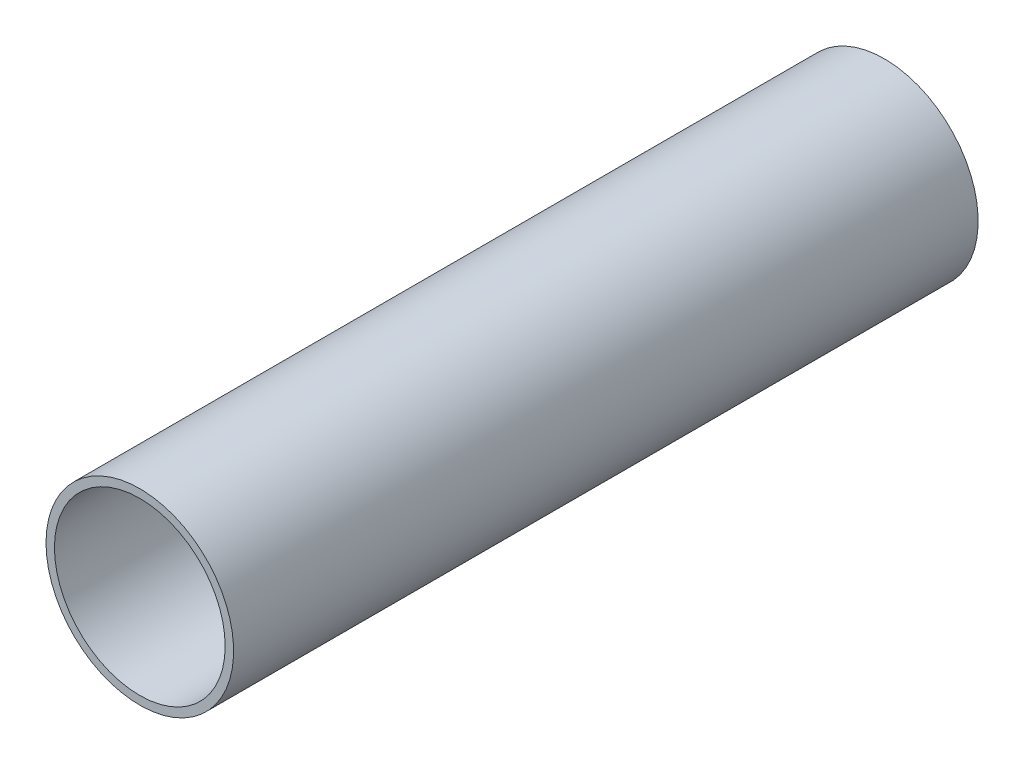
ISO-10303-21;
HEADER;
FILE_DESCRIPTION(('STEP AP214'),'2;1');
FILE_NAME('part.step','',(''),(''),'','','');
FILE_SCHEMA(('AUTOMOTIVE_DESIGN { 1 0 10303 214 1 1 1 1 }'));
ENDSEC;
DATA;
#1=APPLICATION_CONTEXT('core data for automotive mechanical design processes');
#2=APPLICATION_PROTOCOL_DEFINITION('international standard','automotive_design',2000,#1);
#3=PRODUCT_CONTEXT('',#1,'mechanical');
#4=PRODUCT('Part','Part','',(#3));
#5=PRODUCT_RELATED_PRODUCT_CATEGORY('part','',(#4));
#6=PRODUCT_DEFINITION_FORMATION('','',#4);
#7=PRODUCT_DEFINITION_CONTEXT('part definition',#1,'design');
#8=PRODUCT_DEFINITION('design','',#6,#7);
#9=PRODUCT_DEFINITION_SHAPE('','',#8);
#10=(LENGTH_UNIT() NAMED_UNIT(*) SI_UNIT(.MILLI.,.METRE.));
#11=(NAMED_UNIT(*) PLANE_ANGLE_UNIT() SI_UNIT($,.RADIAN.));
#12=(NAMED_UNIT(*) SI_UNIT($,.STERADIAN.) SOLID_ANGLE_UNIT());
#13=UNCERTAINTY_MEASURE_WITH_UNIT(LENGTH_MEASURE(1.E-05),#10,'distance_accuracy_value','');
#14=(GEOMETRIC_REPRESENTATION_CONTEXT(3) GLOBAL_UNCERTAINTY_ASSIGNED_CONTEXT((#13)) GLOBAL_UNIT_ASSIGNED_CONTEXT((#10,
#11,#12)) REPRESENTATION_CONTEXT('',''));
#15=CARTESIAN_POINT('',(0.,0.,0.));
#16=DIRECTION('',(0.,0.,1.));
#17=DIRECTION('',(1.,0.,0.));
#18=AXIS2_PLACEMENT_3D('',#15,#16,#17);
#19=CARTESIAN_POINT('',(0.,0.,152.4));
#20=DIRECTION('',(0.,0.,1.));
#21=DIRECTION('',(1.,0.,0.));
#22=AXIS2_PLACEMENT_3D('',#19,#20,#21);
#23=PLANE('',#22);
#24=CARTESIAN_POINT('',(0.,0.,152.4));
#25=DIRECTION('',(0.,0.,1.));
#26=DIRECTION('',(1.,0.,0.));
#27=AXIS2_PLACEMENT_3D('',#24,#25,#26);
#28=CIRCLE('',#27,19.2);
#29=CARTESIAN_POINT('',(-19.2,0.,152.4));
#30=VERTEX_POINT('',#29);
#31=EDGE_CURVE('E10',#30,#30,#28,.T.);
#32=ORIENTED_EDGE('',*,*,#31,.T.);
#33=EDGE_LOOP('',(#32));
#34=FACE_BOUND('',#33,.T.);
#35=CARTESIAN_POINT('',(0.,0.,152.4));
#36=DIRECTION('',(0.,0.,1.));
#37=DIRECTION('',(1.,0.,0.));
#38=AXIS2_PLACEMENT_3D('',#35,#36,#37);
#39=CIRCLE('',#38,17.475);
#40=CARTESIAN_POINT('',(-17.475,0.,152.4));
#41=VERTEX_POINT('',#40);
#42=EDGE_CURVE('E52',#41,#41,#39,.T.);
#43=ORIENTED_EDGE('',*,*,#42,.F.);
#44=EDGE_LOOP('',(#43));
#45=FACE_BOUND('',#44,.T.);
#46=ADVANCED_FACE('F41',(#34,#45),#23,.T.);
#47=CARTESIAN_POINT('',(0.,0.,0.));
#48=DIRECTION('',(0.,0.,1.));
#49=DIRECTION('',(1.,0.,0.));
#50=AXIS2_PLACEMENT_3D('',#47,#48,#49);
#51=PLANE('',#50);
#52=CARTESIAN_POINT('',(0.,0.,0.));
#53=DIRECTION('',(0.,0.,1.));
#54=DIRECTION('',(1.,0.,0.));
#55=AXIS2_PLACEMENT_3D('',#52,#53,#54);
#56=CIRCLE('',#55,19.2);
#57=CARTESIAN_POINT('',(-19.2,0.,0.));
#58=VERTEX_POINT('',#57);
#59=EDGE_CURVE('E45',#58,#58,#56,.T.);
#60=ORIENTED_EDGE('',*,*,#59,.F.);
#61=EDGE_LOOP('',(#60));
#62=FACE_BOUND('',#61,.T.);
#63=CARTESIAN_POINT('',(0.,0.,0.));
#64=DIRECTION('',(0.,0.,1.));
#65=DIRECTION('',(1.,0.,0.));
#66=AXIS2_PLACEMENT_3D('',#63,#64,#65);
#67=CIRCLE('',#66,17.475);
#68=CARTESIAN_POINT('',(-17.475,0.,0.));
#69=VERTEX_POINT('',#68);
#70=EDGE_CURVE('E54',#69,#69,#67,.T.);
#71=ORIENTED_EDGE('',*,*,#70,.T.);
#72=EDGE_LOOP('',(#71));
#73=FACE_BOUND('',#72,.T.);
#74=ADVANCED_FACE('F64',(#62,#73),#51,.F.);
#75=CARTESIAN_POINT('',(0.,0.,152.4));
#76=DIRECTION('',(0.,0.,-1.));
#77=DIRECTION('',(-1.,0.,0.));
#78=AXIS2_PLACEMENT_3D('',#75,#76,#77);
#79=CYLINDRICAL_SURFACE('',#78,19.2);
#80=CARTESIAN_POINT('',(-19.2,0.,152.4));
#81=CARTESIAN_POINT('',(-19.2,0.,150.8125));
#82=CARTESIAN_POINT('',(-19.2,0.,149.225));
#83=CARTESIAN_POINT('',(-19.2,0.,146.05));
#84=CARTESIAN_POINT('',(-19.2,0.,144.4625));
#85=CARTESIAN_POINT('',(-19.2,0.,141.2875));
#86=CARTESIAN_POINT('',(-19.2,0.,139.7));
#87=CARTESIAN_POINT('',(-19.2,0.,136.525));
#88=CARTESIAN_POINT('',(-19.2,0.,134.9375));
#89=CARTESIAN_POINT('',(-19.2,0.,131.7625));
#90=CARTESIAN_POINT('',(-19.2,0.,130.175));
#91=CARTESIAN_POINT('',(-19.2,0.,127.));
#92=CARTESIAN_POINT('',(-19.2,0.,125.4125));
#93=CARTESIAN_POINT('',(-19.2,0.,122.2375));
#94=CARTESIAN_POINT('',(-19.2,0.,120.65));
#95=CARTESIAN_POINT('',(-19.2,0.,117.475));
#96=CARTESIAN_POINT('',(-19.2,0.,115.8875));
#97=CARTESIAN_POINT('',(-19.2,0.,112.7125));
#98=CARTESIAN_POINT('',(-19.2,0.,111.125));
#99=CARTESIAN_POINT('',(-19.2,0.,107.95));
#100=CARTESIAN_POINT('',(-19.2,0.,106.3625));
#101=CARTESIAN_POINT('',(-19.2,0.,103.1875));
#102=CARTESIAN_POINT('',(-19.2,0.,101.6));
#103=CARTESIAN_POINT('',(-19.2,0.,98.425));
#104=CARTESIAN_POINT('',(-19.2,0.,96.8375));
#105=CARTESIAN_POINT('',(-19.2,0.,93.6625));
#106=CARTESIAN_POINT('',(-19.2,0.,92.075));
#107=CARTESIAN_POINT('',(-19.2,0.,88.9));
#108=CARTESIAN_POINT('',(-19.2,0.,87.3125));
#109=CARTESIAN_POINT('',(-19.2,0.,84.1375));
#110=CARTESIAN_POINT('',(-19.2,0.,82.55));
#111=CARTESIAN_POINT('',(-19.2,0.,79.375));
#112=CARTESIAN_POINT('',(-19.2,0.,77.7875));
#113=CARTESIAN_POINT('',(-19.2,0.,74.6125));
#114=CARTESIAN_POINT('',(-19.2,0.,73.025));
#115=CARTESIAN_POINT('',(-19.2,0.,69.85));
#116=CARTESIAN_POINT('',(-19.2,0.,68.2625));
#117=CARTESIAN_POINT('',(-19.2,0.,65.0875));
#118=CARTESIAN_POINT('',(-19.2,0.,63.5));
#119=CARTESIAN_POINT('',(-19.2,0.,60.325));
#120=CARTESIAN_POINT('',(-19.2,0.,58.7375));
#121=CARTESIAN_POINT('',(-19.2,0.,55.5625));
#122=CARTESIAN_POINT('',(-19.2,0.,53.975));
#123=CARTESIAN_POINT('',(-19.2,0.,50.8));
#124=CARTESIAN_POINT('',(-19.2,0.,49.2125));
#125=CARTESIAN_POINT('',(-19.2,0.,46.0375));
#126=CARTESIAN_POINT('',(-19.2,0.,44.45));
#127=CARTESIAN_POINT('',(-19.2,0.,41.275));
#128=CARTESIAN_POINT('',(-19.2,0.,39.6875));
#129=CARTESIAN_POINT('',(-19.2,0.,36.5125));
#130=CARTESIAN_POINT('',(-19.2,0.,34.925));
#131=CARTESIAN_POINT('',(-19.2,0.,31.75));
#132=CARTESIAN_POINT('',(-19.2,0.,30.1625));
#133=CARTESIAN_POINT('',(-19.2,0.,26.9875));
#134=CARTESIAN_POINT('',(-19.2,0.,25.4));
#135=CARTESIAN_POINT('',(-19.2,0.,22.225));
#136=CARTESIAN_POINT('',(-19.2,0.,20.6375));
#137=CARTESIAN_POINT('',(-19.2,0.,17.4625));
#138=CARTESIAN_POINT('',(-19.2,0.,15.875));
#139=CARTESIAN_POINT('',(-19.2,0.,12.7));
#140=CARTESIAN_POINT('',(-19.2,0.,11.1125));
#141=CARTESIAN_POINT('',(-19.2,0.,7.93750000000001));
#142=CARTESIAN_POINT('',(-19.2,0.,6.35));
#143=CARTESIAN_POINT('',(-19.2,0.,3.175));
#144=CARTESIAN_POINT('',(-19.2,0.,1.5875));
#145=CARTESIAN_POINT('',(-19.2,0.,0.));
#146=B_SPLINE_CURVE_WITH_KNOTS('',3,(#80,#81,#82,#83,#84,#85,#86,#87,#88,#89,#90,#91,#92,#93,
#94,#95,#96,#97,#98,#99,#100,#101,#102,#103,#104,#105,#106,#107,#108,#109,#110,#111,#112,#113,
#114,#115,#116,#117,#118,#119,#120,#121,#122,#123,#124,#125,#126,#127,#128,#129,#130,#131,#132,
#133,#134,#135,#136,#137,#138,#139,#140,#141,#142,#143,#144,#145),.UNSPECIFIED.,.F.,.F.,(4,2,2,
2,2,2,2,2,2,2,2,2,2,2,2,2,2,2,2,2,2,2,2,2,2,2,2,2,2,2,2,2,4),(0.,4.7625,9.52500000000001,
14.2875,19.05,23.8125,28.575,33.3375,38.1,42.8625,47.625,52.3875,57.15,61.9125,66.675,71.4375,
76.2,80.9625,85.725,90.4875,95.25,100.0125,104.775,109.5375,114.3,119.0625,123.825,128.5875,
133.35,138.1125,142.875,147.6375,152.4),.UNSPECIFIED.);
#147=EDGE_CURVE('BSEAM43',#30,#58,#146,.T.);
#148=ORIENTED_EDGE('',*,*,#31,.F.);
#149=ORIENTED_EDGE('',*,*,#59,.T.);
#150=ORIENTED_EDGE('',*,*,#147,.T.);
#151=ORIENTED_EDGE('',*,*,#147,.F.);
#152=EDGE_LOOP('',(#148,#150,#149,#151));
#153=FACE_BOUND('',#152,.T.);
#154=ADVANCED_FACE('F43',(#153),#79,.T.);
#155=CARTESIAN_POINT('',(0.,0.,152.4));
#156=DIRECTION('',(0.,0.,-1.));
#157=DIRECTION('',(-1.,0.,0.));
#158=AXIS2_PLACEMENT_3D('',#155,#156,#157);
#159=CYLINDRICAL_SURFACE('',#158,17.475);
#160=CARTESIAN_POINT('',(-17.475,0.,152.4));
#161=CARTESIAN_POINT('',(-17.475,0.,150.8125));
#162=CARTESIAN_POINT('',(-17.475,0.,149.225));
#163=CARTESIAN_POINT('',(-17.475,0.,146.05));
#164=CARTESIAN_POINT('',(-17.475,0.,144.4625));
#165=CARTESIAN_POINT('',(-17.475,0.,141.2875));
#166=CARTESIAN_POINT('',(-17.475,0.,139.7));
#167=CARTESIAN_POINT('',(-17.475,0.,136.525));
#168=CARTESIAN_POINT('',(-17.475,0.,134.9375));
#169=CARTESIAN_POINT('',(-17.475,0.,131.7625));
#170=CARTESIAN_POINT('',(-17.475,0.,130.175));
#171=CARTESIAN_POINT('',(-17.475,0.,127.));
#172=CARTESIAN_POINT('',(-17.475,0.,125.4125));
#173=CARTESIAN_POINT('',(-17.475,0.,122.2375));
#174=CARTESIAN_POINT('',(-17.475,0.,120.65));
#175=CARTESIAN_POINT('',(-17.475,0.,117.475));
#176=CARTESIAN_POINT('',(-17.475,0.,115.8875));
#177=CARTESIAN_POINT('',(-17.475,0.,112.7125));
#178=CARTESIAN_POINT('',(-17.475,0.,111.125));
#179=CARTESIAN_POINT('',(-17.475,0.,107.95));
#180=CARTESIAN_POINT('',(-17.475,0.,106.3625));
#181=CARTESIAN_POINT('',(-17.475,0.,103.1875));
#182=CARTESIAN_POINT('',(-17.475,0.,101.6));
#183=CARTESIAN_POINT('',(-17.475,0.,98.425));
#184=CARTESIAN_POINT('',(-17.475,0.,96.8375));
#185=CARTESIAN_POINT('',(-17.475,0.,93.6625));
#186=CARTESIAN_POINT('',(-17.475,0.,92.075));
#187=CARTESIAN_POINT('',(-17.475,0.,88.9));
#188=CARTESIAN_POINT('',(-17.475,0.,87.3125));
#189=CARTESIAN_POINT('',(-17.475,0.,84.1375));
#190=CARTESIAN_POINT('',(-17.475,0.,82.55));
#191=CARTESIAN_POINT('',(-17.475,0.,79.375));
#192=CARTESIAN_POINT('',(-17.475,0.,77.7875));
#193=CARTESIAN_POINT('',(-17.475,0.,74.6125));
#194=CARTESIAN_POINT('',(-17.475,0.,73.025));
#195=CARTESIAN_POINT('',(-17.475,0.,69.85));
#196=CARTESIAN_POINT('',(-17.475,0.,68.2625));
#197=CARTESIAN_POINT('',(-17.475,0.,65.0875));
#198=CARTESIAN_POINT('',(-17.475,0.,63.5));
#199=CARTESIAN_POINT('',(-17.475,0.,60.325));
#200=CARTESIAN_POINT('',(-17.475,0.,58.7375));
#201=CARTESIAN_POINT('',(-17.475,0.,55.5625));
#202=CARTESIAN_POINT('',(-17.475,0.,53.975));
#203=CARTESIAN_POINT('',(-17.475,0.,50.8));
#204=CARTESIAN_POINT('',(-17.475,0.,49.2125));
#205=CARTESIAN_POINT('',(-17.475,0.,46.0375));
#206=CARTESIAN_POINT('',(-17.475,0.,44.45));
#207=CARTESIAN_POINT('',(-17.475,0.,41.275));
#208=CARTESIAN_POINT('',(-17.475,0.,39.6875));
#209=CARTESIAN_POINT('',(-17.475,0.,36.5125));
#210=CARTESIAN_POINT('',(-17.475,0.,34.925));
#211=CARTESIAN_POINT('',(-17.475,0.,31.75));
#212=CARTESIAN_POINT('',(-17.475,0.,30.1625));
#213=CARTESIAN_POINT('',(-17.475,0.,26.9875));
#214=CARTESIAN_POINT('',(-17.475,0.,25.4));
#215=CARTESIAN_POINT('',(-17.475,0.,22.225));
#216=CARTESIAN_POINT('',(-17.475,0.,20.6375));
#217=CARTESIAN_POINT('',(-17.475,0.,17.4625));
#218=CARTESIAN_POINT('',(-17.475,0.,15.875));
#219=CARTESIAN_POINT('',(-17.475,0.,12.7));
#220=CARTESIAN_POINT('',(-17.475,0.,11.1125));
#221=CARTESIAN_POINT('',(-17.475,0.,7.93750000000001));
#222=CARTESIAN_POINT('',(-17.475,0.,6.35));
#223=CARTESIAN_POINT('',(-17.475,0.,3.175));
#224=CARTESIAN_POINT('',(-17.475,0.,1.5875));
#225=CARTESIAN_POINT('',(-17.475,0.,0.));
#226=B_SPLINE_CURVE_WITH_KNOTS('',3,(#160,#161,#162,#163,#164,#165,#166,#167,#168,#169,#170,
#171,#172,#173,#174,#175,#176,#177,#178,#179,#180,#181,#182,#183,#184,#185,#186,#187,#188,#189,
#190,#191,#192,#193,#194,#195,#196,#197,#198,#199,#200,#201,#202,#203,#204,#205,#206,#207,#208,
#209,#210,#211,#212,#213,#214,#215,#216,#217,#218,#219,#220,#221,#222,#223,#224,#225),
.UNSPECIFIED.,.F.,.F.,(4,2,2,2,2,2,2,2,2,2,2,2,2,2,2,2,2,2,2,2,2,2,2,2,2,2,2,2,2,2,2,2,4),(0.,
4.7625,9.52500000000001,14.2875,19.05,23.8125,28.575,33.3375,38.1,42.8625,47.625,52.3875,57.15,
61.9125,66.675,71.4375,76.2,80.9625,85.725,90.4875,95.25,100.0125,104.775,109.5375,114.3,
119.0625,123.825,128.5875,133.35,138.1125,142.875,147.6375,152.4),.UNSPECIFIED.);
#227=EDGE_CURVE('BSEAM60',#41,#69,#226,.T.);
#228=ORIENTED_EDGE('',*,*,#42,.T.);
#229=ORIENTED_EDGE('',*,*,#70,.F.);
#230=ORIENTED_EDGE('',*,*,#227,.T.);
#231=ORIENTED_EDGE('',*,*,#227,.F.);
#232=EDGE_LOOP('',(#228,#230,#229,#231));
#233=FACE_BOUND('',#232,.T.);
#234=ADVANCED_FACE('F60',(#233),#159,.F.);
#235=CLOSED_SHELL('',(#46,#74,#154,#234));
#236=MANIFOLD_SOLID_BREP('B2',#235);
#237=ADVANCED_BREP_SHAPE_REPRESENTATION('',(#18,#236),#14);
#238=SHAPE_DEFINITION_REPRESENTATION(#9,#237);
ENDSEC;
END-ISO-10303-21;
